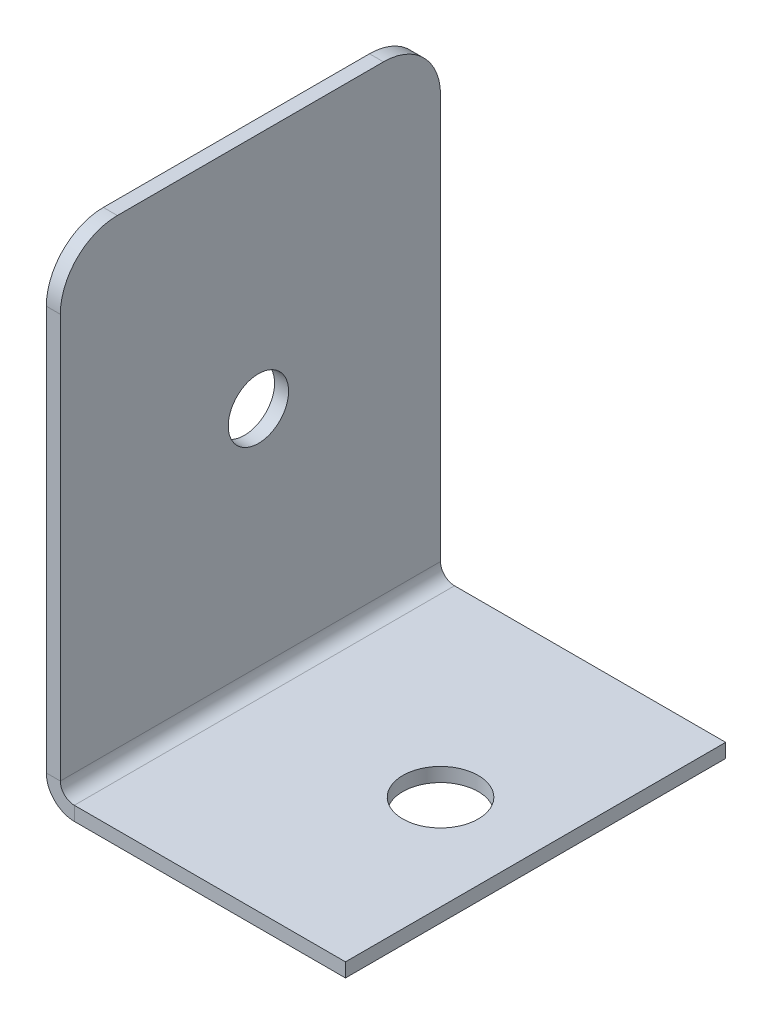
ISO-10303-21;
HEADER;
FILE_DESCRIPTION(('STEP AP214'),'2;1');
FILE_NAME('part.step','',(''),(''),'','','');
FILE_SCHEMA(('AUTOMOTIVE_DESIGN { 1 0 10303 214 1 1 1 1 }'));
ENDSEC;
DATA;
#1=APPLICATION_CONTEXT('core data for automotive mechanical design processes');
#2=APPLICATION_PROTOCOL_DEFINITION('international standard','automotive_design',2000,#1);
#3=PRODUCT_CONTEXT('',#1,'mechanical');
#4=PRODUCT('Part','Part','',(#3));
#5=PRODUCT_RELATED_PRODUCT_CATEGORY('part','',(#4));
#6=PRODUCT_DEFINITION_FORMATION('','',#4);
#7=PRODUCT_DEFINITION_CONTEXT('part definition',#1,'design');
#8=PRODUCT_DEFINITION('design','',#6,#7);
#9=PRODUCT_DEFINITION_SHAPE('','',#8);
#10=(LENGTH_UNIT() NAMED_UNIT(*) SI_UNIT(.MILLI.,.METRE.));
#11=(NAMED_UNIT(*) PLANE_ANGLE_UNIT() SI_UNIT($,.RADIAN.));
#12=(NAMED_UNIT(*) SI_UNIT($,.STERADIAN.) SOLID_ANGLE_UNIT());
#13=UNCERTAINTY_MEASURE_WITH_UNIT(LENGTH_MEASURE(1.E-05),#10,'distance_accuracy_value','');
#14=(GEOMETRIC_REPRESENTATION_CONTEXT(3) GLOBAL_UNCERTAINTY_ASSIGNED_CONTEXT((#13)) GLOBAL_UNIT_ASSIGNED_CONTEXT((#10,
#11,#12)) REPRESENTATION_CONTEXT('',''));
#15=CARTESIAN_POINT('',(0.,0.,0.));
#16=DIRECTION('',(0.,0.,1.));
#17=DIRECTION('',(1.,0.,0.));
#18=AXIS2_PLACEMENT_3D('',#15,#16,#17);
#19=CARTESIAN_POINT('',(0.736599999999997,0.,10.));
#20=DIRECTION('',(0.,0.,1.));
#21=DIRECTION('',(1.,0.,0.));
#22=AXIS2_PLACEMENT_3D('',#19,#20,#21);
#23=PLANE('',#22);
#24=DIRECTION('',(0.,-1.,0.));
#25=VECTOR('',#24,1.);
#26=CARTESIAN_POINT('',(0.736599999999997,0.,10.));
#27=LINE('',#26,#25);
#28=CARTESIAN_POINT('',(0.736599999999997,0.,10.));
#29=VERTEX_POINT('',#28);
#30=CARTESIAN_POINT('',(0.736599999999997,-0.7366,10.));
#31=VERTEX_POINT('',#30);
#32=EDGE_CURVE('E123',#29,#31,#27,.T.);
#33=ORIENTED_EDGE('',*,*,#32,.F.);
#34=CARTESIAN_POINT('',(0.736599999999997,0.7366,10.));
#35=DIRECTION('',(0.,0.,-1.));
#36=DIRECTION('',(-1.,0.,0.));
#37=AXIS2_PLACEMENT_3D('',#34,#35,#36);
#38=CIRCLE('',#37,0.7366);
#39=CARTESIAN_POINT('',(0.,0.7366,10.));
#40=VERTEX_POINT('',#39);
#41=EDGE_CURVE('E143',#40,#29,#38,.F.);
#42=ORIENTED_EDGE('',*,*,#41,.F.);
#43=DIRECTION('',(1.,0.,0.));
#44=VECTOR('',#43,1.);
#45=CARTESIAN_POINT('',(-0.736599999999997,0.7366,10.));
#46=LINE('',#45,#44);
#47=CARTESIAN_POINT('',(-0.736599999999997,0.7366,10.));
#48=VERTEX_POINT('',#47);
#49=EDGE_CURVE('E191',#48,#40,#46,.T.);
#50=ORIENTED_EDGE('',*,*,#49,.F.);
#51=CARTESIAN_POINT('',(0.736599999999997,0.7366,10.));
#52=DIRECTION('',(0.,0.,1.));
#53=DIRECTION('',(1.,0.,0.));
#54=AXIS2_PLACEMENT_3D('',#51,#52,#53);
#55=CIRCLE('',#54,1.4732);
#56=EDGE_CURVE('E153',#48,#31,#55,.T.);
#57=ORIENTED_EDGE('',*,*,#56,.T.);
#58=EDGE_LOOP('',(#33,#42,#50,#57));
#59=FACE_BOUND('',#58,.T.);
#60=ADVANCED_FACE('F38',(#59),#23,.T.);
#61=CARTESIAN_POINT('',(-0.736599999999997,0.7366,10.));
#62=DIRECTION('',(0.,0.,1.));
#63=DIRECTION('',(1.,0.,0.));
#64=AXIS2_PLACEMENT_3D('',#61,#62,#63);
#65=PLANE('',#64);
#66=DIRECTION('',(1.,0.,0.));
#67=VECTOR('',#66,1.);
#68=CARTESIAN_POINT('',(0.,0.,10.));
#69=LINE('',#68,#67);
#70=CARTESIAN_POINT('',(15.,0.,10.));
#71=VERTEX_POINT('',#70);
#72=EDGE_CURVE('E141',#29,#71,#69,.T.);
#73=ORIENTED_EDGE('',*,*,#72,.F.);
#74=ORIENTED_EDGE('',*,*,#32,.T.);
#75=DIRECTION('',(1.,0.,0.));
#76=VECTOR('',#75,1.);
#77=CARTESIAN_POINT('',(0.,-0.7366,10.));
#78=LINE('',#77,#76);
#79=CARTESIAN_POINT('',(15.,-0.7366,10.));
#80=VERTEX_POINT('',#79);
#81=EDGE_CURVE('E116',#31,#80,#78,.T.);
#82=ORIENTED_EDGE('',*,*,#81,.T.);
#83=DIRECTION('',(0.,-1.,0.));
#84=VECTOR('',#83,1.);
#85=CARTESIAN_POINT('',(15.,0.,10.));
#86=LINE('',#85,#84);
#87=EDGE_CURVE('E121',#71,#80,#86,.T.);
#88=ORIENTED_EDGE('',*,*,#87,.F.);
#89=EDGE_LOOP('',(#73,#74,#82,#88));
#90=FACE_BOUND('',#89,.T.);
#91=ADVANCED_FACE('F119',(#90),#65,.T.);
#92=CARTESIAN_POINT('',(0.,0.7366,-9.99999999999999));
#93=DIRECTION('',(0.,0.,-1.));
#94=DIRECTION('',(-1.,0.,0.));
#95=AXIS2_PLACEMENT_3D('',#92,#93,#94);
#96=PLANE('',#95);
#97=DIRECTION('',(-1.,0.,0.));
#98=VECTOR('',#97,1.);
#99=CARTESIAN_POINT('',(0.,0.7366,-9.99999999999999));
#100=LINE('',#99,#98);
#101=CARTESIAN_POINT('',(0.,0.7366,-9.99999999999999));
#102=VERTEX_POINT('',#101);
#103=CARTESIAN_POINT('',(-0.736599999999997,0.7366,-9.99999999999999));
#104=VERTEX_POINT('',#103);
#105=EDGE_CURVE('E188',#102,#104,#100,.T.);
#106=ORIENTED_EDGE('',*,*,#105,.F.);
#107=CARTESIAN_POINT('',(0.736599999999997,0.7366,-9.99999999999999));
#108=DIRECTION('',(0.,0.,-1.));
#109=DIRECTION('',(-1.,0.,0.));
#110=AXIS2_PLACEMENT_3D('',#107,#108,#109);
#111=CIRCLE('',#110,0.7366);
#112=CARTESIAN_POINT('',(0.736599999999997,0.,-9.99999999999999));
#113=VERTEX_POINT('',#112);
#114=EDGE_CURVE('E163',#102,#113,#111,.F.);
#115=ORIENTED_EDGE('',*,*,#114,.T.);
#116=DIRECTION('',(0.,1.,0.));
#117=VECTOR('',#116,1.);
#118=CARTESIAN_POINT('',(0.736599999999997,-0.7366,-9.99999999999999));
#119=LINE('',#118,#117);
#120=CARTESIAN_POINT('',(0.736599999999997,-0.7366,-9.99999999999999));
#121=VERTEX_POINT('',#120);
#122=EDGE_CURVE('E137',#121,#113,#119,.T.);
#123=ORIENTED_EDGE('',*,*,#122,.F.);
#124=CARTESIAN_POINT('',(0.736599999999997,0.7366,-9.99999999999999));
#125=DIRECTION('',(0.,0.,1.));
#126=DIRECTION('',(1.,0.,0.));
#127=AXIS2_PLACEMENT_3D('',#124,#125,#126);
#128=CIRCLE('',#127,1.4732);
#129=EDGE_CURVE('E127',#104,#121,#128,.T.);
#130=ORIENTED_EDGE('',*,*,#129,.F.);
#131=EDGE_LOOP('',(#106,#115,#123,#130));
#132=FACE_BOUND('',#131,.T.);
#133=ADVANCED_FACE('F242',(#132),#96,.T.);
#134=CARTESIAN_POINT('',(0.736599999999997,-0.7366,-9.99999999999999));
#135=DIRECTION('',(0.,0.,-1.));
#136=DIRECTION('',(-1.,0.,0.));
#137=AXIS2_PLACEMENT_3D('',#134,#135,#136);
#138=PLANE('',#137);
#139=DIRECTION('',(0.,-1.,0.));
#140=VECTOR('',#139,1.);
#141=CARTESIAN_POINT('',(-0.736600000000004,25.,-9.99999999999999));
#142=LINE('',#141,#140);
#143=CARTESIAN_POINT('',(-0.736600000000004,22.,-9.99999999999999));
#144=VERTEX_POINT('',#143);
#145=EDGE_CURVE('E168',#144,#104,#142,.T.);
#146=ORIENTED_EDGE('',*,*,#145,.F.);
#147=DIRECTION('',(1.,0.,0.));
#148=VECTOR('',#147,1.);
#149=CARTESIAN_POINT('',(0.736599999999997,22.,-9.99999999999999));
#150=LINE('',#149,#148);
#151=CARTESIAN_POINT('',(0.,22.,-9.99999999999999));
#152=VERTEX_POINT('',#151);
#153=EDGE_CURVE('E195',#144,#152,#150,.T.);
#154=ORIENTED_EDGE('',*,*,#153,.T.);
#155=DIRECTION('',(0.,-1.,0.));
#156=VECTOR('',#155,1.);
#157=CARTESIAN_POINT('',(0.,25.,-9.99999999999999));
#158=LINE('',#157,#156);
#159=EDGE_CURVE('E166',#152,#102,#158,.T.);
#160=ORIENTED_EDGE('',*,*,#159,.T.);
#161=ORIENTED_EDGE('',*,*,#105,.T.);
#162=EDGE_LOOP('',(#146,#154,#160,#161));
#163=FACE_BOUND('',#162,.T.);
#164=ADVANCED_FACE('F215',(#163),#138,.T.);
#165=CARTESIAN_POINT('',(0.,-0.7366,10.));
#166=DIRECTION('',(0.,1.,0.));
#167=DIRECTION('',(0.,0.,1.));
#168=AXIS2_PLACEMENT_3D('',#165,#166,#167);
#169=PLANE('',#168);
#170=CARTESIAN_POINT('',(10.,-0.7366,0.));
#171=DIRECTION('',(0.,1.,0.));
#172=DIRECTION('',(0.,0.,1.));
#173=AXIS2_PLACEMENT_3D('',#170,#171,#172);
#174=CIRCLE('',#173,1.984375);
#175=CARTESIAN_POINT('',(10.,-0.7366,1.984375));
#176=VERTEX_POINT('',#175);
#177=EDGE_CURVE('E278',#176,#176,#174,.T.);
#178=ORIENTED_EDGE('',*,*,#177,.T.);
#179=EDGE_LOOP('',(#178));
#180=FACE_BOUND('',#179,.T.);
#181=DIRECTION('',(1.,0.,0.));
#182=VECTOR('',#181,1.);
#183=CARTESIAN_POINT('',(0.,-0.7366,-9.99999999999999));
#184=LINE('',#183,#182);
#185=CARTESIAN_POINT('',(15.,-0.7366,-9.99999999999999));
#186=VERTEX_POINT('',#185);
#187=EDGE_CURVE('E133',#121,#186,#184,.T.);
#188=ORIENTED_EDGE('',*,*,#187,.T.);
#189=DIRECTION('',(0.,0.,-1.));
#190=VECTOR('',#189,1.);
#191=CARTESIAN_POINT('',(15.,-0.7366,10.));
#192=LINE('',#191,#190);
#193=EDGE_CURVE('E130',#80,#186,#192,.T.);
#194=ORIENTED_EDGE('',*,*,#193,.F.);
#195=ORIENTED_EDGE('',*,*,#81,.F.);
#196=DIRECTION('',(0.,0.,-1.));
#197=VECTOR('',#196,1.);
#198=CARTESIAN_POINT('',(0.736599999999997,-0.7366,10.));
#199=LINE('',#198,#197);
#200=EDGE_CURVE('E155',#31,#121,#199,.T.);
#201=ORIENTED_EDGE('',*,*,#200,.T.);
#202=EDGE_LOOP('',(#188,#194,#195,#201));
#203=FACE_BOUND('',#202,.T.);
#204=ADVANCED_FACE('F131',(#180,#203),#169,.F.);
#205=CARTESIAN_POINT('',(15.,0.,10.));
#206=DIRECTION('',(1.,0.,0.));
#207=DIRECTION('',(0.,0.,-1.));
#208=AXIS2_PLACEMENT_3D('',#205,#206,#207);
#209=PLANE('',#208);
#210=DIRECTION('',(0.,-1.,0.));
#211=VECTOR('',#210,1.);
#212=CARTESIAN_POINT('',(15.,0.,-9.99999999999999));
#213=LINE('',#212,#211);
#214=CARTESIAN_POINT('',(15.,0.,-9.99999999999999));
#215=VERTEX_POINT('',#214);
#216=EDGE_CURVE('E157',#215,#186,#213,.T.);
#217=ORIENTED_EDGE('',*,*,#216,.F.);
#218=DIRECTION('',(0.,0.,-1.));
#219=VECTOR('',#218,1.);
#220=CARTESIAN_POINT('',(15.,0.,10.));
#221=LINE('',#220,#219);
#222=EDGE_CURVE('E138',#71,#215,#221,.T.);
#223=ORIENTED_EDGE('',*,*,#222,.F.);
#224=ORIENTED_EDGE('',*,*,#87,.T.);
#225=ORIENTED_EDGE('',*,*,#193,.T.);
#226=EDGE_LOOP('',(#217,#223,#224,#225));
#227=FACE_BOUND('',#226,.T.);
#228=ADVANCED_FACE('F140',(#227),#209,.T.);
#229=CARTESIAN_POINT('',(0.,0.,10.));
#230=DIRECTION('',(0.,1.,0.));
#231=DIRECTION('',(0.,0.,1.));
#232=AXIS2_PLACEMENT_3D('',#229,#230,#231);
#233=PLANE('',#232);
#234=CARTESIAN_POINT('',(10.,0.,0.));
#235=DIRECTION('',(0.,1.,0.));
#236=DIRECTION('',(0.,0.,1.));
#237=AXIS2_PLACEMENT_3D('',#234,#235,#236);
#238=CIRCLE('',#237,1.984375);
#239=CARTESIAN_POINT('',(10.,0.,1.984375));
#240=VERTEX_POINT('',#239);
#241=EDGE_CURVE('E281',#240,#240,#238,.T.);
#242=ORIENTED_EDGE('',*,*,#241,.F.);
#243=EDGE_LOOP('',(#242));
#244=FACE_BOUND('',#243,.T.);
#245=DIRECTION('',(1.,0.,0.));
#246=VECTOR('',#245,1.);
#247=CARTESIAN_POINT('',(0.,0.,-9.99999999999999));
#248=LINE('',#247,#246);
#249=EDGE_CURVE('E160',#113,#215,#248,.T.);
#250=ORIENTED_EDGE('',*,*,#249,.F.);
#251=DIRECTION('',(0.,0.,-1.));
#252=VECTOR('',#251,1.);
#253=CARTESIAN_POINT('',(0.736599999999997,0.,10.));
#254=LINE('',#253,#252);
#255=EDGE_CURVE('E183',#29,#113,#254,.T.);
#256=ORIENTED_EDGE('',*,*,#255,.F.);
#257=ORIENTED_EDGE('',*,*,#72,.T.);
#258=ORIENTED_EDGE('',*,*,#222,.T.);
#259=EDGE_LOOP('',(#250,#256,#257,#258));
#260=FACE_BOUND('',#259,.T.);
#261=ADVANCED_FACE('F239',(#244,#260),#233,.T.);
#262=CARTESIAN_POINT('',(0.736599999999997,0.7366,10.));
#263=DIRECTION('',(0.,0.,-1.));
#264=DIRECTION('',(-1.,0.,0.));
#265=AXIS2_PLACEMENT_3D('',#262,#263,#264);
#266=CYLINDRICAL_SURFACE('',#265,0.7366);
#267=ORIENTED_EDGE('',*,*,#114,.F.);
#268=DIRECTION('',(0.,0.,-1.));
#269=VECTOR('',#268,1.);
#270=CARTESIAN_POINT('',(0.,0.7366,10.));
#271=LINE('',#270,#269);
#272=EDGE_CURVE('E180',#40,#102,#271,.T.);
#273=ORIENTED_EDGE('',*,*,#272,.F.);
#274=ORIENTED_EDGE('',*,*,#41,.T.);
#275=ORIENTED_EDGE('',*,*,#255,.T.);
#276=EDGE_LOOP('',(#267,#273,#274,#275));
#277=FACE_BOUND('',#276,.T.);
#278=ADVANCED_FACE('F233',(#277),#266,.F.);
#279=CARTESIAN_POINT('',(0.,25.,10.));
#280=DIRECTION('',(1.,0.,0.));
#281=DIRECTION('',(0.,1.,0.));
#282=AXIS2_PLACEMENT_3D('',#279,#280,#281);
#283=PLANE('',#282);
#284=CARTESIAN_POINT('',(0.,12.4934,-0.420000000000004));
#285=DIRECTION('',(1.,0.,0.));
#286=DIRECTION('',(0.,1.,0.));
#287=AXIS2_PLACEMENT_3D('',#284,#285,#286);
#288=CIRCLE('',#287,1.5875);
#289=CARTESIAN_POINT('',(0.,14.0809,-0.420000000000004));
#290=VERTEX_POINT('',#289);
#291=EDGE_CURVE('E284',#290,#290,#288,.T.);
#292=ORIENTED_EDGE('',*,*,#291,.F.);
#293=EDGE_LOOP('',(#292));
#294=FACE_BOUND('',#293,.T.);
#295=ORIENTED_EDGE('',*,*,#159,.F.);
#296=CARTESIAN_POINT('',(0.,22.,-7.00000000000001));
#297=DIRECTION('',(1.,0.,0.));
#298=DIRECTION('',(0.,1.,0.));
#299=AXIS2_PLACEMENT_3D('',#296,#297,#298);
#300=CIRCLE('',#299,3.);
#301=CARTESIAN_POINT('',(0.,25.,-7.00000000000001));
#302=VERTEX_POINT('',#301);
#303=EDGE_CURVE('E200',#152,#302,#300,.T.);
#304=ORIENTED_EDGE('',*,*,#303,.T.);
#305=DIRECTION('',(0.,0.,-1.));
#306=VECTOR('',#305,1.);
#307=CARTESIAN_POINT('',(0.,25.,10.));
#308=LINE('',#307,#306);
#309=CARTESIAN_POINT('',(0.,25.,7.00000000000001));
#310=VERTEX_POINT('',#309);
#311=EDGE_CURVE('E178',#310,#302,#308,.T.);
#312=ORIENTED_EDGE('',*,*,#311,.F.);
#313=CARTESIAN_POINT('',(0.,22.,7.00000000000001));
#314=DIRECTION('',(1.,0.,0.));
#315=DIRECTION('',(0.,1.,0.));
#316=AXIS2_PLACEMENT_3D('',#313,#314,#315);
#317=CIRCLE('',#316,3.);
#318=CARTESIAN_POINT('',(0.,22.,10.));
#319=VERTEX_POINT('',#318);
#320=EDGE_CURVE('E198',#310,#319,#317,.T.);
#321=ORIENTED_EDGE('',*,*,#320,.T.);
#322=DIRECTION('',(0.,-1.,0.));
#323=VECTOR('',#322,1.);
#324=CARTESIAN_POINT('',(0.,25.,10.));
#325=LINE('',#324,#323);
#326=EDGE_CURVE('E149',#319,#40,#325,.T.);
#327=ORIENTED_EDGE('',*,*,#326,.T.);
#328=ORIENTED_EDGE('',*,*,#272,.T.);
#329=EDGE_LOOP('',(#295,#304,#312,#321,#327,#328));
#330=FACE_BOUND('',#329,.T.);
#331=ADVANCED_FACE('F221',(#294,#330),#283,.T.);
#332=CARTESIAN_POINT('',(-0.736600000000004,25.,10.));
#333=DIRECTION('',(0.,1.,0.));
#334=DIRECTION('',(0.,0.,1.));
#335=AXIS2_PLACEMENT_3D('',#332,#333,#334);
#336=PLANE('',#335);
#337=ORIENTED_EDGE('',*,*,#311,.T.);
#338=DIRECTION('',(1.,0.,0.));
#339=VECTOR('',#338,1.);
#340=CARTESIAN_POINT('',(-0.736600000000004,25.,-7.00000000000001));
#341=LINE('',#340,#339);
#342=CARTESIAN_POINT('',(-0.736600000000004,25.,-7.00000000000001));
#343=VERTEX_POINT('',#342);
#344=EDGE_CURVE('E59',#302,#343,#341,.F.);
#345=ORIENTED_EDGE('',*,*,#344,.T.);
#346=DIRECTION('',(0.,0.,-1.));
#347=VECTOR('',#346,1.);
#348=CARTESIAN_POINT('',(-0.736600000000004,25.,10.));
#349=LINE('',#348,#347);
#350=CARTESIAN_POINT('',(-0.736600000000004,25.,7.00000000000001));
#351=VERTEX_POINT('',#350);
#352=EDGE_CURVE('E176',#351,#343,#349,.T.);
#353=ORIENTED_EDGE('',*,*,#352,.F.);
#354=DIRECTION('',(1.,0.,0.));
#355=VECTOR('',#354,1.);
#356=CARTESIAN_POINT('',(0.,25.,7.00000000000001));
#357=LINE('',#356,#355);
#358=EDGE_CURVE('E202',#351,#310,#357,.T.);
#359=ORIENTED_EDGE('',*,*,#358,.T.);
#360=EDGE_LOOP('',(#337,#345,#353,#359));
#361=FACE_BOUND('',#360,.T.);
#362=ADVANCED_FACE('F222',(#361),#336,.T.);
#363=CARTESIAN_POINT('',(-0.736600000000004,25.,10.));
#364=DIRECTION('',(1.,0.,0.));
#365=DIRECTION('',(0.,1.,0.));
#366=AXIS2_PLACEMENT_3D('',#363,#364,#365);
#367=PLANE('',#366);
#368=CARTESIAN_POINT('',(-0.736600000000004,12.4934,-0.420000000000004));
#369=DIRECTION('',(1.,0.,0.));
#370=DIRECTION('',(0.,1.,0.));
#371=AXIS2_PLACEMENT_3D('',#368,#369,#370);
#372=CIRCLE('',#371,1.5875);
#373=CARTESIAN_POINT('',(-0.736600000000004,14.0809,-0.420000000000004));
#374=VERTEX_POINT('',#373);
#375=EDGE_CURVE('E158',#374,#374,#372,.T.);
#376=ORIENTED_EDGE('',*,*,#375,.T.);
#377=EDGE_LOOP('',(#376));
#378=FACE_BOUND('',#377,.T.);
#379=ORIENTED_EDGE('',*,*,#352,.T.);
#380=CARTESIAN_POINT('',(-0.736600000000004,22.,-7.00000000000001));
#381=DIRECTION('',(1.,0.,0.));
#382=DIRECTION('',(0.,1.,0.));
#383=AXIS2_PLACEMENT_3D('',#380,#381,#382);
#384=CIRCLE('',#383,3.);
#385=EDGE_CURVE('E46',#343,#144,#384,.F.);
#386=ORIENTED_EDGE('',*,*,#385,.T.);
#387=ORIENTED_EDGE('',*,*,#145,.T.);
#388=DIRECTION('',(0.,0.,-1.));
#389=VECTOR('',#388,1.);
#390=CARTESIAN_POINT('',(-0.736599999999997,0.7366,10.));
#391=LINE('',#390,#389);
#392=EDGE_CURVE('E173',#48,#104,#391,.T.);
#393=ORIENTED_EDGE('',*,*,#392,.F.);
#394=DIRECTION('',(0.,-1.,0.));
#395=VECTOR('',#394,1.);
#396=CARTESIAN_POINT('',(-0.736600000000004,25.,10.));
#397=LINE('',#396,#395);
#398=CARTESIAN_POINT('',(-0.736600000000004,22.,10.));
#399=VERTEX_POINT('',#398);
#400=EDGE_CURVE('E151',#399,#48,#397,.T.);
#401=ORIENTED_EDGE('',*,*,#400,.F.);
#402=CARTESIAN_POINT('',(-0.736600000000004,22.,7.00000000000001));
#403=DIRECTION('',(1.,0.,0.));
#404=DIRECTION('',(0.,1.,0.));
#405=AXIS2_PLACEMENT_3D('',#402,#403,#404);
#406=CIRCLE('',#405,3.);
#407=EDGE_CURVE('E206',#399,#351,#406,.F.);
#408=ORIENTED_EDGE('',*,*,#407,.T.);
#409=EDGE_LOOP('',(#379,#386,#387,#393,#401,#408));
#410=FACE_BOUND('',#409,.T.);
#411=ADVANCED_FACE('F210',(#378,#410),#367,.F.);
#412=CARTESIAN_POINT('',(0.736599999999997,0.7366,10.));
#413=DIRECTION('',(0.,0.,-1.));
#414=DIRECTION('',(-1.,0.,0.));
#415=AXIS2_PLACEMENT_3D('',#412,#413,#414);
#416=CYLINDRICAL_SURFACE('',#415,1.4732);
#417=ORIENTED_EDGE('',*,*,#129,.T.);
#418=ORIENTED_EDGE('',*,*,#200,.F.);
#419=ORIENTED_EDGE('',*,*,#56,.F.);
#420=ORIENTED_EDGE('',*,*,#392,.T.);
#421=EDGE_LOOP('',(#417,#418,#419,#420));
#422=FACE_BOUND('',#421,.T.);
#423=ADVANCED_FACE('F245',(#422),#416,.T.);
#424=CARTESIAN_POINT('',(0.736599999999997,0.7366,10.));
#425=DIRECTION('',(0.,0.,-1.));
#426=DIRECTION('',(-1.,0.,0.));
#427=AXIS2_PLACEMENT_3D('',#424,#425,#426);
#428=PLANE('',#427);
#429=ORIENTED_EDGE('',*,*,#326,.F.);
#430=DIRECTION('',(1.,0.,0.));
#431=VECTOR('',#430,1.);
#432=CARTESIAN_POINT('',(-0.736600000000004,22.,10.));
#433=LINE('',#432,#431);
#434=EDGE_CURVE('E11',#319,#399,#433,.F.);
#435=ORIENTED_EDGE('',*,*,#434,.T.);
#436=ORIENTED_EDGE('',*,*,#400,.T.);
#437=ORIENTED_EDGE('',*,*,#49,.T.);
#438=EDGE_LOOP('',(#429,#435,#436,#437));
#439=FACE_BOUND('',#438,.T.);
#440=ADVANCED_FACE('F226',(#439),#428,.F.);
#441=CARTESIAN_POINT('',(0.736599999999997,0.7366,-9.99999999999999));
#442=DIRECTION('',(0.,0.,-1.));
#443=DIRECTION('',(-1.,0.,0.));
#444=AXIS2_PLACEMENT_3D('',#441,#442,#443);
#445=PLANE('',#444);
#446=ORIENTED_EDGE('',*,*,#187,.F.);
#447=ORIENTED_EDGE('',*,*,#122,.T.);
#448=ORIENTED_EDGE('',*,*,#249,.T.);
#449=ORIENTED_EDGE('',*,*,#216,.T.);
#450=EDGE_LOOP('',(#446,#447,#448,#449));
#451=FACE_BOUND('',#450,.T.);
#452=ADVANCED_FACE('F246',(#451),#445,.T.);
#453=CARTESIAN_POINT('',(-0.736600000000004,12.4934,-0.420000000000004));
#454=DIRECTION('',(1.,0.,0.));
#455=DIRECTION('',(0.,1.,0.));
#456=AXIS2_PLACEMENT_3D('',#453,#454,#455);
#457=CYLINDRICAL_SURFACE('',#456,1.5875);
#458=ORIENTED_EDGE('',*,*,#375,.F.);
#459=EDGE_LOOP('',(#458));
#460=FACE_BOUND('',#459,.T.);
#461=ORIENTED_EDGE('',*,*,#291,.T.);
#462=EDGE_LOOP('',(#461));
#463=FACE_BOUND('',#462,.T.);
#464=ADVANCED_FACE('F248',(#460,#463),#457,.F.);
#465=CARTESIAN_POINT('',(10.,-0.7366,0.));
#466=DIRECTION('',(0.,1.,0.));
#467=DIRECTION('',(0.,0.,1.));
#468=AXIS2_PLACEMENT_3D('',#465,#466,#467);
#469=CYLINDRICAL_SURFACE('',#468,1.984375);
#470=ORIENTED_EDGE('',*,*,#177,.F.);
#471=EDGE_LOOP('',(#470));
#472=FACE_BOUND('',#471,.T.);
#473=ORIENTED_EDGE('',*,*,#241,.T.);
#474=EDGE_LOOP('',(#473));
#475=FACE_BOUND('',#474,.T.);
#476=ADVANCED_FACE('F254',(#472,#475),#469,.F.);
#477=CARTESIAN_POINT('',(0.736599999999997,22.,-7.00000000000001));
#478=DIRECTION('',(1.,0.,0.));
#479=DIRECTION('',(0.,0.,-1.));
#480=AXIS2_PLACEMENT_3D('',#477,#478,#479);
#481=CYLINDRICAL_SURFACE('',#480,3.);
#482=ORIENTED_EDGE('',*,*,#385,.F.);
#483=ORIENTED_EDGE('',*,*,#344,.F.);
#484=ORIENTED_EDGE('',*,*,#303,.F.);
#485=ORIENTED_EDGE('',*,*,#153,.F.);
#486=EDGE_LOOP('',(#482,#483,#484,#485));
#487=FACE_BOUND('',#486,.T.);
#488=ADVANCED_FACE('F218',(#487),#481,.T.);
#489=CARTESIAN_POINT('',(-0.736600000000004,22.,7.00000000000001));
#490=DIRECTION('',(-1.,0.,0.));
#491=DIRECTION('',(0.,0.,1.));
#492=AXIS2_PLACEMENT_3D('',#489,#490,#491);
#493=CYLINDRICAL_SURFACE('',#492,3.);
#494=ORIENTED_EDGE('',*,*,#407,.F.);
#495=ORIENTED_EDGE('',*,*,#434,.F.);
#496=ORIENTED_EDGE('',*,*,#320,.F.);
#497=ORIENTED_EDGE('',*,*,#358,.F.);
#498=EDGE_LOOP('',(#494,#495,#496,#497));
#499=FACE_BOUND('',#498,.T.);
#500=ADVANCED_FACE('F40',(#499),#493,.T.);
#501=CLOSED_SHELL('',(#60,#91,#133,#164,#204,#228,#261,#278,#331,#362,#411,#423,#440,#452,#464,
#476,#488,#500));
#502=MANIFOLD_SOLID_BREP('B2',#501);
#503=ADVANCED_BREP_SHAPE_REPRESENTATION('',(#18,#502),#14);
#504=SHAPE_DEFINITION_REPRESENTATION(#9,#503);
ENDSEC;
END-ISO-10303-21;
